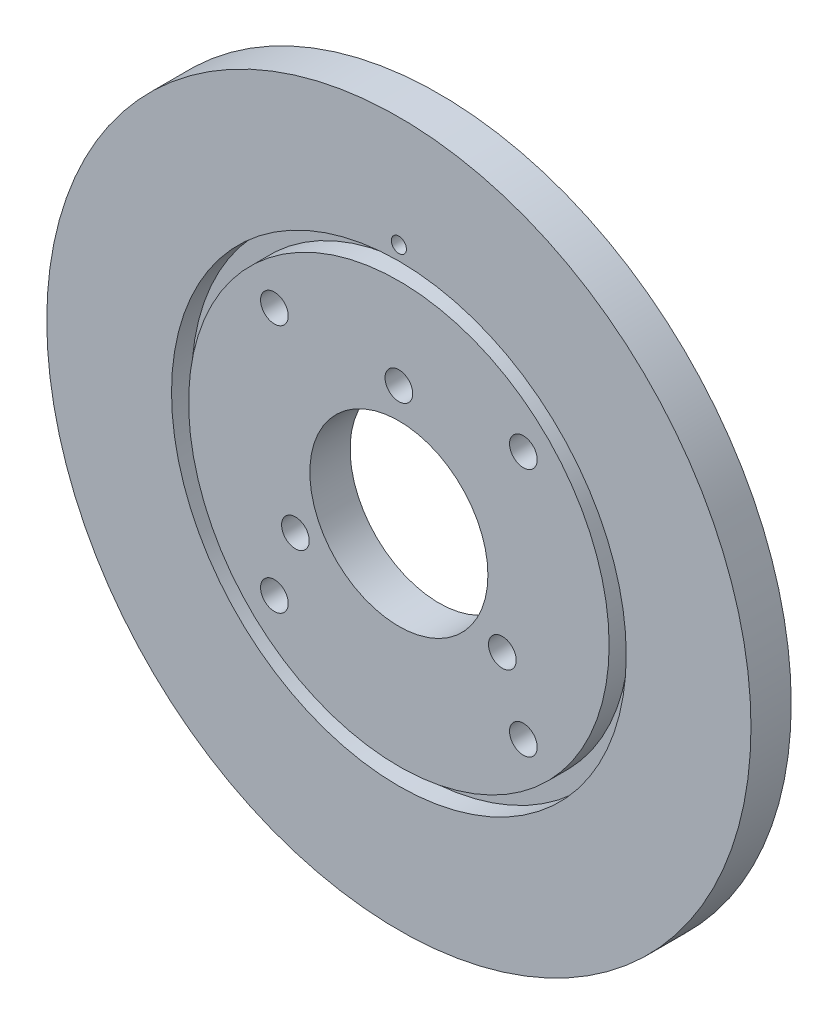
ISO-10303-21;
HEADER;
FILE_DESCRIPTION(('STEP AP214'),'2;1');
FILE_NAME('part.step','',(''),(''),'','','');
FILE_SCHEMA(('AUTOMOTIVE_DESIGN { 1 0 10303 214 1 1 1 1 }'));
ENDSEC;
DATA;
#1=APPLICATION_CONTEXT('core data for automotive mechanical design processes');
#2=APPLICATION_PROTOCOL_DEFINITION('international standard','automotive_design',2000,#1);
#3=PRODUCT_CONTEXT('',#1,'mechanical');
#4=PRODUCT('Part','Part','',(#3));
#5=PRODUCT_RELATED_PRODUCT_CATEGORY('part','',(#4));
#6=PRODUCT_DEFINITION_FORMATION('','',#4);
#7=PRODUCT_DEFINITION_CONTEXT('part definition',#1,'design');
#8=PRODUCT_DEFINITION('design','',#6,#7);
#9=PRODUCT_DEFINITION_SHAPE('','',#8);
#10=(LENGTH_UNIT() NAMED_UNIT(*) SI_UNIT(.MILLI.,.METRE.));
#11=(NAMED_UNIT(*) PLANE_ANGLE_UNIT() SI_UNIT($,.RADIAN.));
#12=(NAMED_UNIT(*) SI_UNIT($,.STERADIAN.) SOLID_ANGLE_UNIT());
#13=UNCERTAINTY_MEASURE_WITH_UNIT(LENGTH_MEASURE(1.E-05),#10,'distance_accuracy_value','');
#14=(GEOMETRIC_REPRESENTATION_CONTEXT(3) GLOBAL_UNCERTAINTY_ASSIGNED_CONTEXT((#13)) GLOBAL_UNIT_ASSIGNED_CONTEXT((#10,
#11,#12)) REPRESENTATION_CONTEXT('',''));
#15=CARTESIAN_POINT('',(0.,0.,0.));
#16=DIRECTION('',(0.,0.,1.));
#17=DIRECTION('',(1.,0.,0.));
#18=AXIS2_PLACEMENT_3D('',#15,#16,#17);
#19=CARTESIAN_POINT('',(0.,0.,0.));
#20=DIRECTION('',(0.,0.,1.));
#21=DIRECTION('',(1.,0.,0.));
#22=AXIS2_PLACEMENT_3D('',#19,#20,#21);
#23=PLANE('',#22);
#24=CARTESIAN_POINT('',(0.,0.,0.));
#25=DIRECTION('',(0.,0.,1.));
#26=DIRECTION('',(1.,0.,0.));
#27=AXIS2_PLACEMENT_3D('',#24,#25,#26);
#28=CIRCLE('',#27,17.7);
#29=CARTESIAN_POINT('',(17.7,0.,0.));
#30=VERTEX_POINT('',#29);
#31=EDGE_CURVE('E55',#30,#30,#28,.T.);
#32=ORIENTED_EDGE('',*,*,#31,.F.);
#33=EDGE_LOOP('',(#32));
#34=FACE_BOUND('',#33,.T.);
#35=CARTESIAN_POINT('',(24.7487373415292,24.7487373415292,0.));
#36=DIRECTION('',(0.,0.,1.));
#37=DIRECTION('',(1.,0.,0.));
#38=AXIS2_PLACEMENT_3D('',#35,#36,#37);
#39=CIRCLE('',#38,2.75);
#40=CARTESIAN_POINT('',(27.4987373415292,24.7487373415292,0.));
#41=VERTEX_POINT('',#40);
#42=EDGE_CURVE('E63',#41,#41,#39,.T.);
#43=ORIENTED_EDGE('',*,*,#42,.F.);
#44=EDGE_LOOP('',(#43));
#45=FACE_BOUND('',#44,.T.);
#46=CARTESIAN_POINT('',(-24.7487373415292,24.7487373415292,0.));
#47=DIRECTION('',(0.,0.,1.));
#48=DIRECTION('',(1.,0.,0.));
#49=AXIS2_PLACEMENT_3D('',#46,#47,#48);
#50=CIRCLE('',#49,2.75);
#51=CARTESIAN_POINT('',(-21.9987373415292,24.7487373415292,0.));
#52=VERTEX_POINT('',#51);
#53=EDGE_CURVE('E71',#52,#52,#50,.T.);
#54=ORIENTED_EDGE('',*,*,#53,.F.);
#55=EDGE_LOOP('',(#54));
#56=FACE_BOUND('',#55,.T.);
#57=CARTESIAN_POINT('',(-24.7487373415292,-24.7487373415292,0.));
#58=DIRECTION('',(0.,0.,1.));
#59=DIRECTION('',(1.,0.,0.));
#60=AXIS2_PLACEMENT_3D('',#57,#58,#59);
#61=CIRCLE('',#60,2.75);
#62=CARTESIAN_POINT('',(-21.9987373415292,-24.7487373415292,0.));
#63=VERTEX_POINT('',#62);
#64=EDGE_CURVE('E79',#63,#63,#61,.T.);
#65=ORIENTED_EDGE('',*,*,#64,.F.);
#66=EDGE_LOOP('',(#65));
#67=FACE_BOUND('',#66,.T.);
#68=CARTESIAN_POINT('',(24.7487373415292,-24.7487373415292,0.));
#69=DIRECTION('',(0.,0.,1.));
#70=DIRECTION('',(1.,0.,0.));
#71=AXIS2_PLACEMENT_3D('',#68,#69,#70);
#72=CIRCLE('',#71,2.75);
#73=CARTESIAN_POINT('',(27.4987373415292,-24.7487373415292,0.));
#74=VERTEX_POINT('',#73);
#75=EDGE_CURVE('E87',#74,#74,#72,.T.);
#76=ORIENTED_EDGE('',*,*,#75,.F.);
#77=EDGE_LOOP('',(#76));
#78=FACE_BOUND('',#77,.T.);
#79=CARTESIAN_POINT('',(0.,23.75,0.));
#80=DIRECTION('',(0.,0.,1.));
#81=DIRECTION('',(1.,0.,0.));
#82=AXIS2_PLACEMENT_3D('',#79,#80,#81);
#83=CIRCLE('',#82,2.75);
#84=CARTESIAN_POINT('',(2.75,23.75,0.));
#85=VERTEX_POINT('',#84);
#86=EDGE_CURVE('E95',#85,#85,#83,.T.);
#87=ORIENTED_EDGE('',*,*,#86,.F.);
#88=EDGE_LOOP('',(#87));
#89=FACE_BOUND('',#88,.T.);
#90=CARTESIAN_POINT('',(-20.5681033398804,-11.875,0.));
#91=DIRECTION('',(0.,0.,1.));
#92=DIRECTION('',(1.,0.,0.));
#93=AXIS2_PLACEMENT_3D('',#90,#91,#92);
#94=CIRCLE('',#93,2.75);
#95=CARTESIAN_POINT('',(-17.8181033398804,-11.875,0.));
#96=VERTEX_POINT('',#95);
#97=EDGE_CURVE('E103',#96,#96,#94,.T.);
#98=ORIENTED_EDGE('',*,*,#97,.F.);
#99=EDGE_LOOP('',(#98));
#100=FACE_BOUND('',#99,.T.);
#101=CARTESIAN_POINT('',(20.5681033398804,-11.875,0.));
#102=DIRECTION('',(0.,0.,1.));
#103=DIRECTION('',(1.,0.,0.));
#104=AXIS2_PLACEMENT_3D('',#101,#102,#103);
#105=CIRCLE('',#104,2.75);
#106=CARTESIAN_POINT('',(23.3181033398804,-11.875,0.));
#107=VERTEX_POINT('',#106);
#108=EDGE_CURVE('E111',#107,#107,#105,.T.);
#109=ORIENTED_EDGE('',*,*,#108,.F.);
#110=EDGE_LOOP('',(#109));
#111=FACE_BOUND('',#110,.T.);
#112=CARTESIAN_POINT('',(0.,0.,0.));
#113=DIRECTION('',(0.,0.,1.));
#114=DIRECTION('',(1.,0.,0.));
#115=AXIS2_PLACEMENT_3D('',#112,#113,#114);
#116=CIRCLE('',#115,41.8);
#117=CARTESIAN_POINT('',(41.8,0.,0.));
#118=VERTEX_POINT('',#117);
#119=EDGE_CURVE('E135',#118,#118,#116,.T.);
#120=ORIENTED_EDGE('',*,*,#119,.T.);
#121=EDGE_LOOP('',(#120));
#122=FACE_BOUND('',#121,.T.);
#123=ADVANCED_FACE('F40',(#34,#45,#56,#67,#78,#89,#100,#111,#122),#23,.T.);
#124=CARTESIAN_POINT('',(0.,0.,-8.));
#125=DIRECTION('',(0.,0.,1.));
#126=DIRECTION('',(1.,0.,0.));
#127=AXIS2_PLACEMENT_3D('',#124,#125,#126);
#128=CYLINDRICAL_SURFACE('',#127,70.);
#129=CARTESIAN_POINT('',(0.,0.,-8.));
#130=DIRECTION('',(0.,0.,1.));
#131=DIRECTION('',(1.,0.,0.));
#132=AXIS2_PLACEMENT_3D('',#129,#130,#131);
#133=CIRCLE('',#132,70.);
#134=CARTESIAN_POINT('',(70.,0.,-8.));
#135=VERTEX_POINT('',#134);
#136=EDGE_CURVE('E10',#135,#135,#133,.T.);
#137=ORIENTED_EDGE('',*,*,#136,.T.);
#138=EDGE_LOOP('',(#137));
#139=FACE_BOUND('',#138,.T.);
#140=CARTESIAN_POINT('',(0.,0.,0.));
#141=DIRECTION('',(0.,0.,1.));
#142=DIRECTION('',(1.,0.,0.));
#143=AXIS2_PLACEMENT_3D('',#140,#141,#142);
#144=CIRCLE('',#143,70.);
#145=CARTESIAN_POINT('',(70.,0.,0.));
#146=VERTEX_POINT('',#145);
#147=EDGE_CURVE('E44',#146,#146,#144,.T.);
#148=ORIENTED_EDGE('',*,*,#147,.F.);
#149=EDGE_LOOP('',(#148));
#150=FACE_BOUND('',#149,.T.);
#151=ADVANCED_FACE('F42',(#139,#150),#128,.T.);
#152=CARTESIAN_POINT('',(0.,0.,-8.));
#153=DIRECTION('',(0.,0.,1.));
#154=DIRECTION('',(1.,0.,0.));
#155=AXIS2_PLACEMENT_3D('',#152,#153,#154);
#156=PLANE('',#155);
#157=CARTESIAN_POINT('',(0.,48.,-8.));
#158=DIRECTION('',(0.,0.,1.));
#159=DIRECTION('',(1.,0.,0.));
#160=AXIS2_PLACEMENT_3D('',#157,#158,#159);
#161=CIRCLE('',#160,1.5);
#162=CARTESIAN_POINT('',(1.5,48.,-8.));
#163=VERTEX_POINT('',#162);
#164=EDGE_CURVE('E115',#163,#163,#161,.T.);
#165=ORIENTED_EDGE('',*,*,#164,.T.);
#166=EDGE_LOOP('',(#165));
#167=FACE_BOUND('',#166,.T.);
#168=CARTESIAN_POINT('',(20.5681033398804,-11.875,-8.));
#169=DIRECTION('',(0.,0.,1.));
#170=DIRECTION('',(1.,0.,0.));
#171=AXIS2_PLACEMENT_3D('',#168,#169,#170);
#172=CIRCLE('',#171,2.75);
#173=CARTESIAN_POINT('',(23.3181033398804,-11.875,-8.));
#174=VERTEX_POINT('',#173);
#175=EDGE_CURVE('E107',#174,#174,#172,.T.);
#176=ORIENTED_EDGE('',*,*,#175,.T.);
#177=EDGE_LOOP('',(#176));
#178=FACE_BOUND('',#177,.T.);
#179=CARTESIAN_POINT('',(-20.5681033398804,-11.875,-8.));
#180=DIRECTION('',(0.,0.,1.));
#181=DIRECTION('',(1.,0.,0.));
#182=AXIS2_PLACEMENT_3D('',#179,#180,#181);
#183=CIRCLE('',#182,2.75);
#184=CARTESIAN_POINT('',(-17.8181033398804,-11.875,-8.));
#185=VERTEX_POINT('',#184);
#186=EDGE_CURVE('E99',#185,#185,#183,.T.);
#187=ORIENTED_EDGE('',*,*,#186,.T.);
#188=EDGE_LOOP('',(#187));
#189=FACE_BOUND('',#188,.T.);
#190=CARTESIAN_POINT('',(0.,23.75,-8.));
#191=DIRECTION('',(0.,0.,1.));
#192=DIRECTION('',(1.,0.,0.));
#193=AXIS2_PLACEMENT_3D('',#190,#191,#192);
#194=CIRCLE('',#193,2.75);
#195=CARTESIAN_POINT('',(2.75,23.75,-8.));
#196=VERTEX_POINT('',#195);
#197=EDGE_CURVE('E91',#196,#196,#194,.T.);
#198=ORIENTED_EDGE('',*,*,#197,.T.);
#199=EDGE_LOOP('',(#198));
#200=FACE_BOUND('',#199,.T.);
#201=CARTESIAN_POINT('',(24.7487373415292,-24.7487373415292,-8.));
#202=DIRECTION('',(0.,0.,1.));
#203=DIRECTION('',(1.,0.,0.));
#204=AXIS2_PLACEMENT_3D('',#201,#202,#203);
#205=CIRCLE('',#204,2.75);
#206=CARTESIAN_POINT('',(27.4987373415292,-24.7487373415292,-8.));
#207=VERTEX_POINT('',#206);
#208=EDGE_CURVE('E83',#207,#207,#205,.T.);
#209=ORIENTED_EDGE('',*,*,#208,.T.);
#210=EDGE_LOOP('',(#209));
#211=FACE_BOUND('',#210,.T.);
#212=CARTESIAN_POINT('',(-24.7487373415292,-24.7487373415292,-8.));
#213=DIRECTION('',(0.,0.,1.));
#214=DIRECTION('',(1.,0.,0.));
#215=AXIS2_PLACEMENT_3D('',#212,#213,#214);
#216=CIRCLE('',#215,2.75);
#217=CARTESIAN_POINT('',(-21.9987373415292,-24.7487373415292,-8.));
#218=VERTEX_POINT('',#217);
#219=EDGE_CURVE('E75',#218,#218,#216,.T.);
#220=ORIENTED_EDGE('',*,*,#219,.T.);
#221=EDGE_LOOP('',(#220));
#222=FACE_BOUND('',#221,.T.);
#223=CARTESIAN_POINT('',(-24.7487373415292,24.7487373415292,-8.));
#224=DIRECTION('',(0.,0.,1.));
#225=DIRECTION('',(1.,0.,0.));
#226=AXIS2_PLACEMENT_3D('',#223,#224,#225);
#227=CIRCLE('',#226,2.75);
#228=CARTESIAN_POINT('',(-21.9987373415292,24.7487373415292,-8.));
#229=VERTEX_POINT('',#228);
#230=EDGE_CURVE('E67',#229,#229,#227,.T.);
#231=ORIENTED_EDGE('',*,*,#230,.T.);
#232=EDGE_LOOP('',(#231));
#233=FACE_BOUND('',#232,.T.);
#234=CARTESIAN_POINT('',(24.7487373415292,24.7487373415292,-8.));
#235=DIRECTION('',(0.,0.,1.));
#236=DIRECTION('',(1.,0.,0.));
#237=AXIS2_PLACEMENT_3D('',#234,#235,#236);
#238=CIRCLE('',#237,2.75);
#239=CARTESIAN_POINT('',(27.4987373415292,24.7487373415292,-8.));
#240=VERTEX_POINT('',#239);
#241=EDGE_CURVE('E59',#240,#240,#238,.T.);
#242=ORIENTED_EDGE('',*,*,#241,.T.);
#243=EDGE_LOOP('',(#242));
#244=FACE_BOUND('',#243,.T.);
#245=CARTESIAN_POINT('',(0.,0.,-8.));
#246=DIRECTION('',(0.,0.,1.));
#247=DIRECTION('',(1.,0.,0.));
#248=AXIS2_PLACEMENT_3D('',#245,#246,#247);
#249=CIRCLE('',#248,17.7);
#250=CARTESIAN_POINT('',(17.7,0.,-8.));
#251=VERTEX_POINT('',#250);
#252=EDGE_CURVE('E53',#251,#251,#249,.T.);
#253=ORIENTED_EDGE('',*,*,#252,.T.);
#254=EDGE_LOOP('',(#253));
#255=FACE_BOUND('',#254,.T.);
#256=ORIENTED_EDGE('',*,*,#136,.F.);
#257=EDGE_LOOP('',(#256));
#258=FACE_BOUND('',#257,.T.);
#259=ADVANCED_FACE('F163',(#167,#178,#189,#200,#211,#222,#233,#244,#255,#258),#156,.F.);
#260=CARTESIAN_POINT('',(0.,0.,0.));
#261=DIRECTION('',(0.,0.,1.));
#262=DIRECTION('',(1.,0.,0.));
#263=AXIS2_PLACEMENT_3D('',#260,#261,#262);
#264=CIRCLE('',#263,45.2);
#265=CARTESIAN_POINT('',(45.2,0.,0.));
#266=VERTEX_POINT('',#265);
#267=EDGE_CURVE('E127',#266,#266,#264,.T.);
#268=ORIENTED_EDGE('',*,*,#267,.F.);
#269=EDGE_LOOP('',(#268));
#270=FACE_BOUND('',#269,.T.);
#271=CARTESIAN_POINT('',(0.,48.,0.));
#272=DIRECTION('',(0.,0.,1.));
#273=DIRECTION('',(1.,0.,0.));
#274=AXIS2_PLACEMENT_3D('',#271,#272,#273);
#275=CIRCLE('',#274,1.5);
#276=CARTESIAN_POINT('',(1.5,48.,0.));
#277=VERTEX_POINT('',#276);
#278=EDGE_CURVE('E119',#277,#277,#275,.T.);
#279=ORIENTED_EDGE('',*,*,#278,.F.);
#280=EDGE_LOOP('',(#279));
#281=FACE_BOUND('',#280,.T.);
#282=ORIENTED_EDGE('',*,*,#147,.T.);
#283=EDGE_LOOP('',(#282));
#284=FACE_BOUND('',#283,.T.);
#285=ADVANCED_FACE('F159',(#270,#281,#284),#23,.T.);
#286=CARTESIAN_POINT('',(0.,0.,-8.));
#287=DIRECTION('',(0.,0.,1.));
#288=DIRECTION('',(1.,0.,0.));
#289=AXIS2_PLACEMENT_3D('',#286,#287,#288);
#290=CYLINDRICAL_SURFACE('',#289,17.7);
#291=ORIENTED_EDGE('',*,*,#252,.F.);
#292=EDGE_LOOP('',(#291));
#293=FACE_BOUND('',#292,.T.);
#294=ORIENTED_EDGE('',*,*,#31,.T.);
#295=EDGE_LOOP('',(#294));
#296=FACE_BOUND('',#295,.T.);
#297=ADVANCED_FACE('F162',(#293,#296),#290,.F.);
#298=CARTESIAN_POINT('',(24.7487373415292,24.7487373415292,-8.));
#299=DIRECTION('',(0.,0.,1.));
#300=DIRECTION('',(1.,0.,0.));
#301=AXIS2_PLACEMENT_3D('',#298,#299,#300);
#302=CYLINDRICAL_SURFACE('',#301,2.75);
#303=ORIENTED_EDGE('',*,*,#241,.F.);
#304=EDGE_LOOP('',(#303));
#305=FACE_BOUND('',#304,.T.);
#306=ORIENTED_EDGE('',*,*,#42,.T.);
#307=EDGE_LOOP('',(#306));
#308=FACE_BOUND('',#307,.T.);
#309=ADVANCED_FACE('F183',(#305,#308),#302,.F.);
#310=CARTESIAN_POINT('',(-24.7487373415292,24.7487373415292,-8.));
#311=DIRECTION('',(0.,0.,1.));
#312=DIRECTION('',(1.,0.,0.));
#313=AXIS2_PLACEMENT_3D('',#310,#311,#312);
#314=CYLINDRICAL_SURFACE('',#313,2.75);
#315=ORIENTED_EDGE('',*,*,#230,.F.);
#316=EDGE_LOOP('',(#315));
#317=FACE_BOUND('',#316,.T.);
#318=ORIENTED_EDGE('',*,*,#53,.T.);
#319=EDGE_LOOP('',(#318));
#320=FACE_BOUND('',#319,.T.);
#321=ADVANCED_FACE('F187',(#317,#320),#314,.F.);
#322=CARTESIAN_POINT('',(-24.7487373415292,-24.7487373415292,-8.));
#323=DIRECTION('',(0.,0.,1.));
#324=DIRECTION('',(1.,0.,0.));
#325=AXIS2_PLACEMENT_3D('',#322,#323,#324);
#326=CYLINDRICAL_SURFACE('',#325,2.75);
#327=ORIENTED_EDGE('',*,*,#219,.F.);
#328=EDGE_LOOP('',(#327));
#329=FACE_BOUND('',#328,.T.);
#330=ORIENTED_EDGE('',*,*,#64,.T.);
#331=EDGE_LOOP('',(#330));
#332=FACE_BOUND('',#331,.T.);
#333=ADVANCED_FACE('F191',(#329,#332),#326,.F.);
#334=CARTESIAN_POINT('',(24.7487373415292,-24.7487373415292,-8.));
#335=DIRECTION('',(0.,0.,1.));
#336=DIRECTION('',(1.,0.,0.));
#337=AXIS2_PLACEMENT_3D('',#334,#335,#336);
#338=CYLINDRICAL_SURFACE('',#337,2.75);
#339=ORIENTED_EDGE('',*,*,#208,.F.);
#340=EDGE_LOOP('',(#339));
#341=FACE_BOUND('',#340,.T.);
#342=ORIENTED_EDGE('',*,*,#75,.T.);
#343=EDGE_LOOP('',(#342));
#344=FACE_BOUND('',#343,.T.);
#345=ADVANCED_FACE('F195',(#341,#344),#338,.F.);
#346=CARTESIAN_POINT('',(0.,23.75,-8.));
#347=DIRECTION('',(0.,0.,1.));
#348=DIRECTION('',(1.,0.,0.));
#349=AXIS2_PLACEMENT_3D('',#346,#347,#348);
#350=CYLINDRICAL_SURFACE('',#349,2.75);
#351=ORIENTED_EDGE('',*,*,#197,.F.);
#352=EDGE_LOOP('',(#351));
#353=FACE_BOUND('',#352,.T.);
#354=ORIENTED_EDGE('',*,*,#86,.T.);
#355=EDGE_LOOP('',(#354));
#356=FACE_BOUND('',#355,.T.);
#357=ADVANCED_FACE('F199',(#353,#356),#350,.F.);
#358=CARTESIAN_POINT('',(-20.5681033398804,-11.875,-8.));
#359=DIRECTION('',(0.,0.,1.));
#360=DIRECTION('',(1.,0.,0.));
#361=AXIS2_PLACEMENT_3D('',#358,#359,#360);
#362=CYLINDRICAL_SURFACE('',#361,2.75);
#363=ORIENTED_EDGE('',*,*,#186,.F.);
#364=EDGE_LOOP('',(#363));
#365=FACE_BOUND('',#364,.T.);
#366=ORIENTED_EDGE('',*,*,#97,.T.);
#367=EDGE_LOOP('',(#366));
#368=FACE_BOUND('',#367,.T.);
#369=ADVANCED_FACE('F203',(#365,#368),#362,.F.);
#370=CARTESIAN_POINT('',(20.5681033398804,-11.875,-8.));
#371=DIRECTION('',(0.,0.,1.));
#372=DIRECTION('',(1.,0.,0.));
#373=AXIS2_PLACEMENT_3D('',#370,#371,#372);
#374=CYLINDRICAL_SURFACE('',#373,2.75);
#375=ORIENTED_EDGE('',*,*,#175,.F.);
#376=EDGE_LOOP('',(#375));
#377=FACE_BOUND('',#376,.T.);
#378=ORIENTED_EDGE('',*,*,#108,.T.);
#379=EDGE_LOOP('',(#378));
#380=FACE_BOUND('',#379,.T.);
#381=ADVANCED_FACE('F207',(#377,#380),#374,.F.);
#382=CARTESIAN_POINT('',(0.,48.,-8.));
#383=DIRECTION('',(0.,0.,1.));
#384=DIRECTION('',(1.,0.,0.));
#385=AXIS2_PLACEMENT_3D('',#382,#383,#384);
#386=CYLINDRICAL_SURFACE('',#385,1.5);
#387=ORIENTED_EDGE('',*,*,#164,.F.);
#388=EDGE_LOOP('',(#387));
#389=FACE_BOUND('',#388,.T.);
#390=ORIENTED_EDGE('',*,*,#278,.T.);
#391=EDGE_LOOP('',(#390));
#392=FACE_BOUND('',#391,.T.);
#393=ADVANCED_FACE('F155',(#389,#392),#386,.F.);
#394=CARTESIAN_POINT('',(0.,0.,-4.));
#395=DIRECTION('',(0.,0.,1.));
#396=DIRECTION('',(1.,0.,0.));
#397=AXIS2_PLACEMENT_3D('',#394,#395,#396);
#398=CYLINDRICAL_SURFACE('',#397,45.2);
#399=CARTESIAN_POINT('',(0.,0.,-4.));
#400=DIRECTION('',(0.,0.,1.));
#401=DIRECTION('',(1.,0.,0.));
#402=AXIS2_PLACEMENT_3D('',#399,#400,#401);
#403=CIRCLE('',#402,45.2);
#404=CARTESIAN_POINT('',(45.2,0.,-4.));
#405=VERTEX_POINT('',#404);
#406=EDGE_CURVE('E123',#405,#405,#403,.T.);
#407=ORIENTED_EDGE('',*,*,#406,.F.);
#408=EDGE_LOOP('',(#407));
#409=FACE_BOUND('',#408,.T.);
#410=ORIENTED_EDGE('',*,*,#267,.T.);
#411=EDGE_LOOP('',(#410));
#412=FACE_BOUND('',#411,.T.);
#413=ADVANCED_FACE('F149',(#409,#412),#398,.F.);
#414=CARTESIAN_POINT('',(0.,0.,-4.));
#415=DIRECTION('',(0.,0.,1.));
#416=DIRECTION('',(1.,0.,0.));
#417=AXIS2_PLACEMENT_3D('',#414,#415,#416);
#418=PLANE('',#417);
#419=CARTESIAN_POINT('',(0.,0.,-4.));
#420=DIRECTION('',(0.,0.,1.));
#421=DIRECTION('',(1.,0.,0.));
#422=AXIS2_PLACEMENT_3D('',#419,#420,#421);
#423=CIRCLE('',#422,41.8);
#424=CARTESIAN_POINT('',(41.8,0.,-4.));
#425=VERTEX_POINT('',#424);
#426=EDGE_CURVE('E131',#425,#425,#423,.T.);
#427=ORIENTED_EDGE('',*,*,#426,.F.);
#428=EDGE_LOOP('',(#427));
#429=FACE_BOUND('',#428,.T.);
#430=ORIENTED_EDGE('',*,*,#406,.T.);
#431=EDGE_LOOP('',(#430));
#432=FACE_BOUND('',#431,.T.);
#433=ADVANCED_FACE('F146',(#429,#432),#418,.T.);
#434=CARTESIAN_POINT('',(0.,0.,-4.));
#435=DIRECTION('',(0.,0.,1.));
#436=DIRECTION('',(1.,0.,0.));
#437=AXIS2_PLACEMENT_3D('',#434,#435,#436);
#438=CYLINDRICAL_SURFACE('',#437,41.8);
#439=ORIENTED_EDGE('',*,*,#426,.T.);
#440=EDGE_LOOP('',(#439));
#441=FACE_BOUND('',#440,.T.);
#442=ORIENTED_EDGE('',*,*,#119,.F.);
#443=EDGE_LOOP('',(#442));
#444=FACE_BOUND('',#443,.T.);
#445=ADVANCED_FACE('F143',(#441,#444),#438,.T.);
#446=CLOSED_SHELL('',(#123,#151,#259,#285,#297,#309,#321,#333,#345,#357,#369,#381,#393,#413,
#433,#445));
#447=MANIFOLD_SOLID_BREP('B2',#446);
#448=ADVANCED_BREP_SHAPE_REPRESENTATION('',(#18,#447),#14);
#449=SHAPE_DEFINITION_REPRESENTATION(#9,#448);
ENDSEC;
END-ISO-10303-21;
